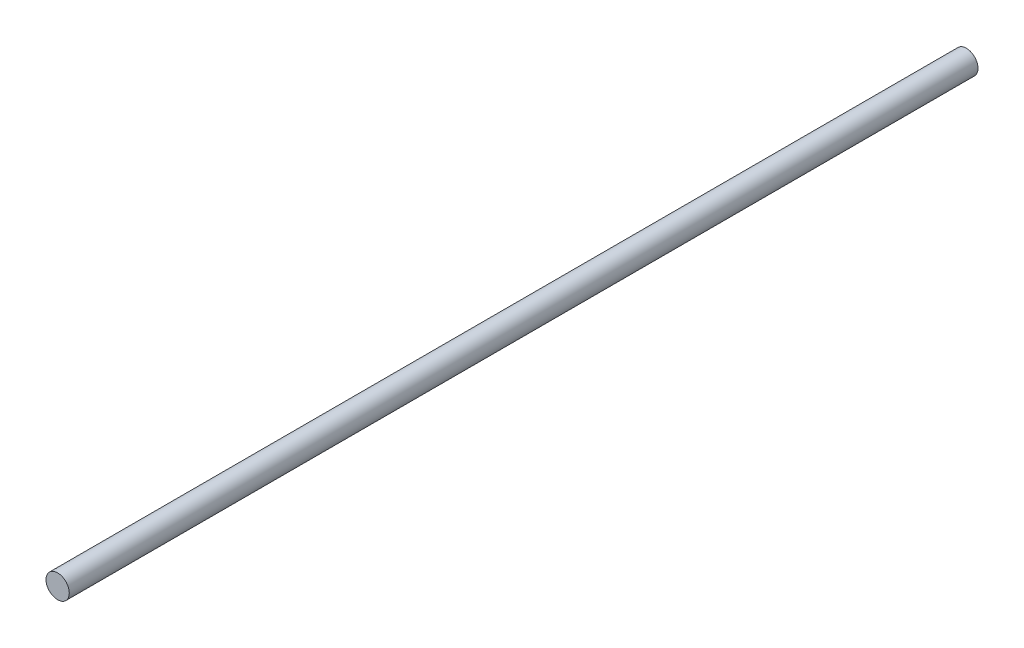
ISO-10303-21;
HEADER;
FILE_DESCRIPTION(('STEP AP214'),'2;1');
FILE_NAME('part.step','',(''),(''),'','','');
FILE_SCHEMA(('AUTOMOTIVE_DESIGN { 1 0 10303 214 1 1 1 1 }'));
ENDSEC;
DATA;
#1=APPLICATION_CONTEXT('core data for automotive mechanical design processes');
#2=APPLICATION_PROTOCOL_DEFINITION('international standard','automotive_design',2000,#1);
#3=PRODUCT_CONTEXT('',#1,'mechanical');
#4=PRODUCT('Part','Part','',(#3));
#5=PRODUCT_RELATED_PRODUCT_CATEGORY('part','',(#4));
#6=PRODUCT_DEFINITION_FORMATION('','',#4);
#7=PRODUCT_DEFINITION_CONTEXT('part definition',#1,'design');
#8=PRODUCT_DEFINITION('design','',#6,#7);
#9=PRODUCT_DEFINITION_SHAPE('','',#8);
#10=(LENGTH_UNIT() NAMED_UNIT(*) SI_UNIT(.MILLI.,.METRE.));
#11=(NAMED_UNIT(*) PLANE_ANGLE_UNIT() SI_UNIT($,.RADIAN.));
#12=(NAMED_UNIT(*) SI_UNIT($,.STERADIAN.) SOLID_ANGLE_UNIT());
#13=UNCERTAINTY_MEASURE_WITH_UNIT(LENGTH_MEASURE(1.E-05),#10,'distance_accuracy_value','');
#14=(GEOMETRIC_REPRESENTATION_CONTEXT(3) GLOBAL_UNCERTAINTY_ASSIGNED_CONTEXT((#13)) GLOBAL_UNIT_ASSIGNED_CONTEXT((#10,
#11,#12)) REPRESENTATION_CONTEXT('',''));
#15=CARTESIAN_POINT('',(0.,0.,0.));
#16=DIRECTION('',(0.,0.,1.));
#17=DIRECTION('',(1.,0.,0.));
#18=AXIS2_PLACEMENT_3D('',#15,#16,#17);
#19=CARTESIAN_POINT('',(0.,0.,195.));
#20=DIRECTION('',(0.,0.,-1.));
#21=DIRECTION('',(-1.,0.,0.));
#22=AXIS2_PLACEMENT_3D('',#19,#20,#21);
#23=CYLINDRICAL_SURFACE('',#22,2.5);
#24=CARTESIAN_POINT('',(0.,0.,195.));
#25=DIRECTION('',(0.,0.,1.));
#26=DIRECTION('',(1.,0.,0.));
#27=AXIS2_PLACEMENT_3D('',#24,#25,#26);
#28=CIRCLE('',#27,2.5);
#29=CARTESIAN_POINT('',(2.5,0.,195.));
#30=VERTEX_POINT('',#29);
#31=EDGE_CURVE('E10',#30,#30,#28,.T.);
#32=ORIENTED_EDGE('',*,*,#31,.F.);
#33=EDGE_LOOP('',(#32));
#34=FACE_BOUND('',#33,.T.);
#35=CARTESIAN_POINT('',(0.,0.,0.));
#36=DIRECTION('',(0.,0.,1.));
#37=DIRECTION('',(1.,0.,0.));
#38=AXIS2_PLACEMENT_3D('',#35,#36,#37);
#39=CIRCLE('',#38,2.5);
#40=CARTESIAN_POINT('',(2.5,0.,0.));
#41=VERTEX_POINT('',#40);
#42=EDGE_CURVE('E34',#41,#41,#39,.T.);
#43=ORIENTED_EDGE('',*,*,#42,.T.);
#44=EDGE_LOOP('',(#43));
#45=FACE_BOUND('',#44,.T.);
#46=ADVANCED_FACE('F31',(#34,#45),#23,.T.);
#47=CARTESIAN_POINT('',(0.,0.,195.));
#48=DIRECTION('',(0.,0.,1.));
#49=DIRECTION('',(1.,0.,0.));
#50=AXIS2_PLACEMENT_3D('',#47,#48,#49);
#51=PLANE('',#50);
#52=ORIENTED_EDGE('',*,*,#31,.T.);
#53=EDGE_LOOP('',(#52));
#54=FACE_BOUND('',#53,.T.);
#55=ADVANCED_FACE('F46',(#54),#51,.T.);
#56=CARTESIAN_POINT('',(0.,0.,0.));
#57=DIRECTION('',(0.,0.,1.));
#58=DIRECTION('',(1.,0.,0.));
#59=AXIS2_PLACEMENT_3D('',#56,#57,#58);
#60=PLANE('',#59);
#61=ORIENTED_EDGE('',*,*,#42,.F.);
#62=EDGE_LOOP('',(#61));
#63=FACE_BOUND('',#62,.T.);
#64=ADVANCED_FACE('F44',(#63),#60,.F.);
#65=CLOSED_SHELL('',(#46,#55,#64));
#66=MANIFOLD_SOLID_BREP('B2',#65);
#67=ADVANCED_BREP_SHAPE_REPRESENTATION('',(#18,#66),#14);
#68=SHAPE_DEFINITION_REPRESENTATION(#9,#67);
ENDSEC;
END-ISO-10303-21;
